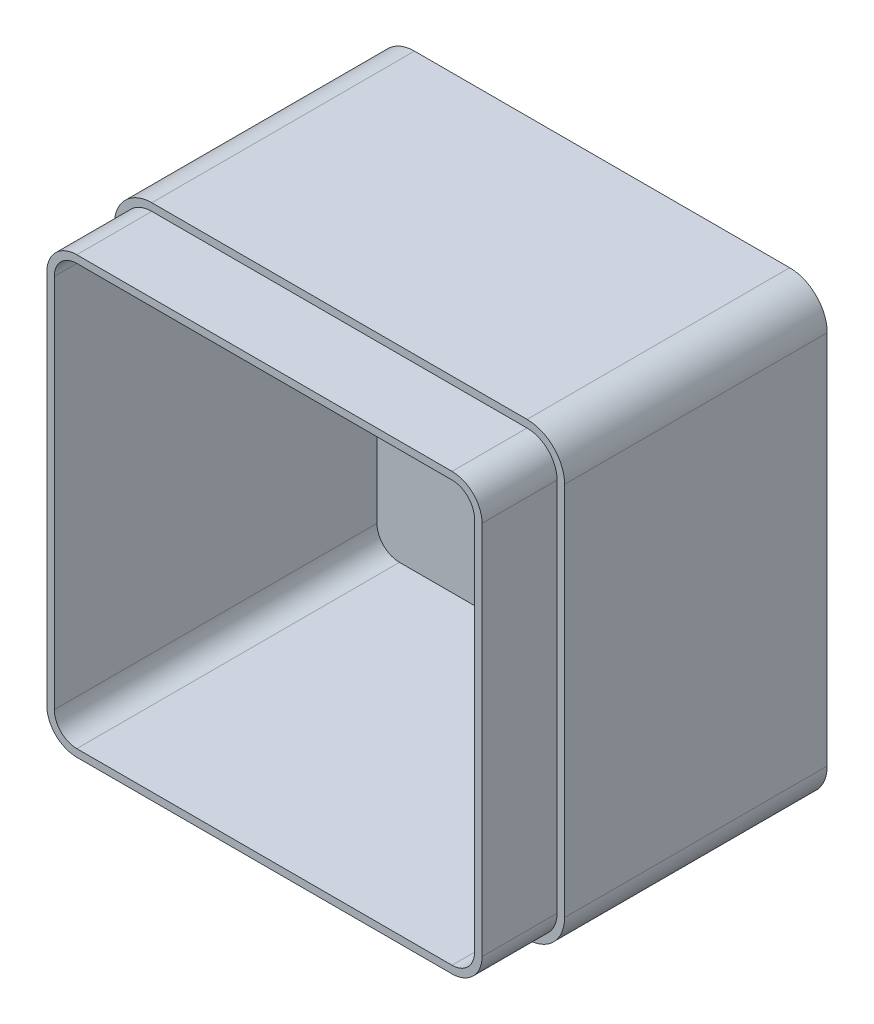
ISO-10303-21;
HEADER;
FILE_DESCRIPTION(('STEP AP214'),'2;1');
FILE_NAME('part.step','',(''),(''),'','','');
FILE_SCHEMA(('AUTOMOTIVE_DESIGN { 1 0 10303 214 1 1 1 1 }'));
ENDSEC;
DATA;
#1=APPLICATION_CONTEXT('core data for automotive mechanical design processes');
#2=APPLICATION_PROTOCOL_DEFINITION('international standard','automotive_design',2000,#1);
#3=PRODUCT_CONTEXT('',#1,'mechanical');
#4=PRODUCT('Part','Part','',(#3));
#5=PRODUCT_RELATED_PRODUCT_CATEGORY('part','',(#4));
#6=PRODUCT_DEFINITION_FORMATION('','',#4);
#7=PRODUCT_DEFINITION_CONTEXT('part definition',#1,'design');
#8=PRODUCT_DEFINITION('design','',#6,#7);
#9=PRODUCT_DEFINITION_SHAPE('','',#8);
#10=(LENGTH_UNIT() NAMED_UNIT(*) SI_UNIT(.MILLI.,.METRE.));
#11=(NAMED_UNIT(*) PLANE_ANGLE_UNIT() SI_UNIT($,.RADIAN.));
#12=(NAMED_UNIT(*) SI_UNIT($,.STERADIAN.) SOLID_ANGLE_UNIT());
#13=UNCERTAINTY_MEASURE_WITH_UNIT(LENGTH_MEASURE(1.E-05),#10,'distance_accuracy_value','');
#14=(GEOMETRIC_REPRESENTATION_CONTEXT(3) GLOBAL_UNCERTAINTY_ASSIGNED_CONTEXT((#13)) GLOBAL_UNIT_ASSIGNED_CONTEXT((#10,
#11,#12)) REPRESENTATION_CONTEXT('',''));
#15=CARTESIAN_POINT('',(0.,0.,0.));
#16=DIRECTION('',(0.,0.,1.));
#17=DIRECTION('',(1.,0.,0.));
#18=AXIS2_PLACEMENT_3D('',#15,#16,#17);
#19=CARTESIAN_POINT('',(0.,0.,90.));
#20=DIRECTION('',(0.,0.,-1.));
#21=DIRECTION('',(-1.,0.,0.));
#22=AXIS2_PLACEMENT_3D('',#19,#20,#21);
#23=PLANE('',#22);
#24=DIRECTION('',(0.,1.,0.));
#25=VECTOR('',#24,1.);
#26=CARTESIAN_POINT('',(116.,0.,90.));
#27=LINE('',#26,#25);
#28=CARTESIAN_POINT('',(116.,10.,90.));
#29=VERTEX_POINT('',#28);
#30=CARTESIAN_POINT('',(116.,110.,90.));
#31=VERTEX_POINT('',#30);
#32=EDGE_CURVE('E340',#29,#31,#27,.T.);
#33=ORIENTED_EDGE('',*,*,#32,.F.);
#34=CARTESIAN_POINT('',(110.,10.,90.));
#35=DIRECTION('',(0.,0.,-1.));
#36=DIRECTION('',(-1.,0.,0.));
#37=AXIS2_PLACEMENT_3D('',#34,#35,#36);
#38=CIRCLE('',#37,6.);
#39=CARTESIAN_POINT('',(110.,4.,90.));
#40=VERTEX_POINT('',#39);
#41=EDGE_CURVE('E338',#40,#29,#38,.F.);
#42=ORIENTED_EDGE('',*,*,#41,.F.);
#43=DIRECTION('',(1.,0.,0.));
#44=VECTOR('',#43,1.);
#45=CARTESIAN_POINT('',(0.,4.,90.));
#46=LINE('',#45,#44);
#47=CARTESIAN_POINT('',(9.99999999999999,4.,90.));
#48=VERTEX_POINT('',#47);
#49=EDGE_CURVE('E335',#48,#40,#46,.T.);
#50=ORIENTED_EDGE('',*,*,#49,.F.);
#51=CARTESIAN_POINT('',(9.99999999999999,10.,90.));
#52=DIRECTION('',(0.,0.,-1.));
#53=DIRECTION('',(-1.,0.,0.));
#54=AXIS2_PLACEMENT_3D('',#51,#52,#53);
#55=CIRCLE('',#54,6.);
#56=CARTESIAN_POINT('',(4.,10.,90.));
#57=VERTEX_POINT('',#56);
#58=EDGE_CURVE('E336',#57,#48,#55,.F.);
#59=ORIENTED_EDGE('',*,*,#58,.F.);
#60=DIRECTION('',(0.,-1.,0.));
#61=VECTOR('',#60,1.);
#62=CARTESIAN_POINT('',(4.,0.,90.));
#63=LINE('',#62,#61);
#64=CARTESIAN_POINT('',(3.99999999999997,110.,90.));
#65=VERTEX_POINT('',#64);
#66=EDGE_CURVE('E301',#65,#57,#63,.T.);
#67=ORIENTED_EDGE('',*,*,#66,.F.);
#68=CARTESIAN_POINT('',(9.99999999999997,110.,90.));
#69=DIRECTION('',(0.,0.,-1.));
#70=DIRECTION('',(-1.,0.,0.));
#71=AXIS2_PLACEMENT_3D('',#68,#69,#70);
#72=CIRCLE('',#71,6.);
#73=CARTESIAN_POINT('',(9.99999999999997,116.,90.));
#74=VERTEX_POINT('',#73);
#75=EDGE_CURVE('E327',#74,#65,#72,.F.);
#76=ORIENTED_EDGE('',*,*,#75,.F.);
#77=DIRECTION('',(-1.,0.,0.));
#78=VECTOR('',#77,1.);
#79=CARTESIAN_POINT('',(0.,116.,90.));
#80=LINE('',#79,#78);
#81=CARTESIAN_POINT('',(110.,116.,90.));
#82=VERTEX_POINT('',#81);
#83=EDGE_CURVE('E332',#82,#74,#80,.T.);
#84=ORIENTED_EDGE('',*,*,#83,.F.);
#85=CARTESIAN_POINT('',(110.,110.,90.));
#86=DIRECTION('',(0.,0.,-1.));
#87=DIRECTION('',(-1.,0.,0.));
#88=AXIS2_PLACEMENT_3D('',#85,#86,#87);
#89=CIRCLE('',#88,6.);
#90=EDGE_CURVE('E322',#31,#82,#89,.F.);
#91=ORIENTED_EDGE('',*,*,#90,.F.);
#92=EDGE_LOOP('',(#33,#42,#50,#59,#67,#76,#84,#91));
#93=FACE_BOUND('',#92,.T.);
#94=CARTESIAN_POINT('',(110.,10.,90.));
#95=DIRECTION('',(0.,0.,1.));
#96=DIRECTION('',(1.,0.,0.));
#97=AXIS2_PLACEMENT_3D('',#94,#95,#96);
#98=CIRCLE('',#97,7.99999999999999);
#99=CARTESIAN_POINT('',(110.,2.,90.));
#100=VERTEX_POINT('',#99);
#101=CARTESIAN_POINT('',(118.,10.,90.));
#102=VERTEX_POINT('',#101);
#103=EDGE_CURVE('E245',#100,#102,#98,.T.);
#104=ORIENTED_EDGE('',*,*,#103,.T.);
#105=DIRECTION('',(0.,1.,0.));
#106=VECTOR('',#105,1.);
#107=CARTESIAN_POINT('',(118.,10.,90.));
#108=LINE('',#107,#106);
#109=CARTESIAN_POINT('',(118.,110.,90.));
#110=VERTEX_POINT('',#109);
#111=EDGE_CURVE('E205',#102,#110,#108,.T.);
#112=ORIENTED_EDGE('',*,*,#111,.T.);
#113=CARTESIAN_POINT('',(110.,110.,90.));
#114=DIRECTION('',(0.,0.,1.));
#115=DIRECTION('',(1.,0.,0.));
#116=AXIS2_PLACEMENT_3D('',#113,#114,#115);
#117=CIRCLE('',#116,7.99999999999999);
#118=CARTESIAN_POINT('',(110.,118.,90.));
#119=VERTEX_POINT('',#118);
#120=EDGE_CURVE('E53',#110,#119,#117,.T.);
#121=ORIENTED_EDGE('',*,*,#120,.T.);
#122=DIRECTION('',(-1.,0.,0.));
#123=VECTOR('',#122,1.);
#124=CARTESIAN_POINT('',(110.,118.,90.));
#125=LINE('',#124,#123);
#126=CARTESIAN_POINT('',(9.99999999999997,118.,90.));
#127=VERTEX_POINT('',#126);
#128=EDGE_CURVE('E249',#119,#127,#125,.T.);
#129=ORIENTED_EDGE('',*,*,#128,.T.);
#130=CARTESIAN_POINT('',(9.99999999999997,110.,90.));
#131=DIRECTION('',(0.,0.,1.));
#132=DIRECTION('',(1.,0.,0.));
#133=AXIS2_PLACEMENT_3D('',#130,#131,#132);
#134=CIRCLE('',#133,7.99999999999999);
#135=CARTESIAN_POINT('',(1.99999999999998,110.,90.));
#136=VERTEX_POINT('',#135);
#137=EDGE_CURVE('E252',#127,#136,#134,.T.);
#138=ORIENTED_EDGE('',*,*,#137,.T.);
#139=DIRECTION('',(0.,-1.,0.));
#140=VECTOR('',#139,1.);
#141=CARTESIAN_POINT('',(1.99999999999998,110.,90.));
#142=LINE('',#141,#140);
#143=CARTESIAN_POINT('',(2.,9.99999999999999,90.));
#144=VERTEX_POINT('',#143);
#145=EDGE_CURVE('E255',#136,#144,#142,.T.);
#146=ORIENTED_EDGE('',*,*,#145,.T.);
#147=CARTESIAN_POINT('',(9.99999999999999,10.,90.));
#148=DIRECTION('',(0.,0.,1.));
#149=DIRECTION('',(1.,0.,0.));
#150=AXIS2_PLACEMENT_3D('',#147,#148,#149);
#151=CIRCLE('',#150,8.);
#152=CARTESIAN_POINT('',(9.99999999999999,2.,90.));
#153=VERTEX_POINT('',#152);
#154=EDGE_CURVE('E228',#144,#153,#151,.T.);
#155=ORIENTED_EDGE('',*,*,#154,.T.);
#156=DIRECTION('',(1.,0.,0.));
#157=VECTOR('',#156,1.);
#158=CARTESIAN_POINT('',(10.,2.,90.));
#159=LINE('',#158,#157);
#160=EDGE_CURVE('E225',#153,#100,#159,.T.);
#161=ORIENTED_EDGE('',*,*,#160,.T.);
#162=EDGE_LOOP('',(#104,#112,#121,#129,#138,#146,#155,#161));
#163=FACE_BOUND('',#162,.T.);
#164=ADVANCED_FACE('F38',(#93,#163),#23,.F.);
#165=CARTESIAN_POINT('',(4.,0.,90.));
#166=DIRECTION('',(1.,0.,0.));
#167=DIRECTION('',(0.,1.,0.));
#168=AXIS2_PLACEMENT_3D('',#165,#166,#167);
#169=PLANE('',#168);
#170=DIRECTION('',(0.,-1.,0.));
#171=VECTOR('',#170,1.);
#172=CARTESIAN_POINT('',(4.,0.,4.));
#173=LINE('',#172,#171);
#174=CARTESIAN_POINT('',(3.99999999999997,110.,4.));
#175=VERTEX_POINT('',#174);
#176=CARTESIAN_POINT('',(4.,10.,4.));
#177=VERTEX_POINT('',#176);
#178=EDGE_CURVE('E287',#175,#177,#173,.T.);
#179=ORIENTED_EDGE('',*,*,#178,.F.);
#180=DIRECTION('',(0.,0.,1.));
#181=VECTOR('',#180,1.);
#182=CARTESIAN_POINT('',(3.99999999999997,110.,90.));
#183=LINE('',#182,#181);
#184=EDGE_CURVE('E294',#65,#175,#183,.F.);
#185=ORIENTED_EDGE('',*,*,#184,.F.);
#186=ORIENTED_EDGE('',*,*,#66,.T.);
#187=DIRECTION('',(0.,0.,1.));
#188=VECTOR('',#187,1.);
#189=CARTESIAN_POINT('',(4.,10.,90.));
#190=LINE('',#189,#188);
#191=EDGE_CURVE('E291',#177,#57,#190,.T.);
#192=ORIENTED_EDGE('',*,*,#191,.F.);
#193=EDGE_LOOP('',(#179,#185,#186,#192));
#194=FACE_BOUND('',#193,.T.);
#195=ADVANCED_FACE('F431',(#194),#169,.T.);
#196=CARTESIAN_POINT('',(0.,4.,90.));
#197=DIRECTION('',(0.,1.,0.));
#198=DIRECTION('',(0.,0.,1.));
#199=AXIS2_PLACEMENT_3D('',#196,#197,#198);
#200=PLANE('',#199);
#201=DIRECTION('',(1.,0.,0.));
#202=VECTOR('',#201,1.);
#203=CARTESIAN_POINT('',(0.,4.,4.));
#204=LINE('',#203,#202);
#205=CARTESIAN_POINT('',(9.99999999999999,4.,4.));
#206=VERTEX_POINT('',#205);
#207=CARTESIAN_POINT('',(110.,4.,4.));
#208=VERTEX_POINT('',#207);
#209=EDGE_CURVE('E290',#206,#208,#204,.T.);
#210=ORIENTED_EDGE('',*,*,#209,.F.);
#211=DIRECTION('',(0.,0.,1.));
#212=VECTOR('',#211,1.);
#213=CARTESIAN_POINT('',(9.99999999999999,4.,90.));
#214=LINE('',#213,#212);
#215=EDGE_CURVE('E319',#48,#206,#214,.F.);
#216=ORIENTED_EDGE('',*,*,#215,.F.);
#217=ORIENTED_EDGE('',*,*,#49,.T.);
#218=DIRECTION('',(0.,0.,1.));
#219=VECTOR('',#218,1.);
#220=CARTESIAN_POINT('',(110.,4.,90.));
#221=LINE('',#220,#219);
#222=EDGE_CURVE('E297',#208,#40,#221,.T.);
#223=ORIENTED_EDGE('',*,*,#222,.F.);
#224=EDGE_LOOP('',(#210,#216,#217,#223));
#225=FACE_BOUND('',#224,.T.);
#226=ADVANCED_FACE('F437',(#225),#200,.T.);
#227=CARTESIAN_POINT('',(116.,0.,90.));
#228=DIRECTION('',(-1.,0.,0.));
#229=DIRECTION('',(0.,-1.,0.));
#230=AXIS2_PLACEMENT_3D('',#227,#228,#229);
#231=PLANE('',#230);
#232=DIRECTION('',(0.,1.,0.));
#233=VECTOR('',#232,1.);
#234=CARTESIAN_POINT('',(116.,0.,4.));
#235=LINE('',#234,#233);
#236=CARTESIAN_POINT('',(116.,10.,4.));
#237=VERTEX_POINT('',#236);
#238=CARTESIAN_POINT('',(116.,110.,4.));
#239=VERTEX_POINT('',#238);
#240=EDGE_CURVE('E302',#237,#239,#235,.T.);
#241=ORIENTED_EDGE('',*,*,#240,.F.);
#242=DIRECTION('',(0.,0.,1.));
#243=VECTOR('',#242,1.);
#244=CARTESIAN_POINT('',(116.,10.,90.));
#245=LINE('',#244,#243);
#246=EDGE_CURVE('E305',#29,#237,#245,.F.);
#247=ORIENTED_EDGE('',*,*,#246,.F.);
#248=ORIENTED_EDGE('',*,*,#32,.T.);
#249=DIRECTION('',(0.,0.,1.));
#250=VECTOR('',#249,1.);
#251=CARTESIAN_POINT('',(116.,110.,90.));
#252=LINE('',#251,#250);
#253=EDGE_CURVE('E325',#239,#31,#252,.T.);
#254=ORIENTED_EDGE('',*,*,#253,.F.);
#255=EDGE_LOOP('',(#241,#247,#248,#254));
#256=FACE_BOUND('',#255,.T.);
#257=ADVANCED_FACE('F466',(#256),#231,.T.);
#258=CARTESIAN_POINT('',(0.,116.,90.));
#259=DIRECTION('',(0.,-1.,0.));
#260=DIRECTION('',(0.,0.,-1.));
#261=AXIS2_PLACEMENT_3D('',#258,#259,#260);
#262=PLANE('',#261);
#263=ORIENTED_EDGE('',*,*,#83,.T.);
#264=DIRECTION('',(0.,0.,-1.));
#265=VECTOR('',#264,1.);
#266=CARTESIAN_POINT('',(9.99999999999997,116.,90.));
#267=LINE('',#266,#265);
#268=CARTESIAN_POINT('',(9.99999999999997,116.,4.));
#269=VERTEX_POINT('',#268);
#270=EDGE_CURVE('E330',#269,#74,#267,.F.);
#271=ORIENTED_EDGE('',*,*,#270,.F.);
#272=DIRECTION('',(-1.,0.,0.));
#273=VECTOR('',#272,1.);
#274=CARTESIAN_POINT('',(0.,116.,4.));
#275=LINE('',#274,#273);
#276=CARTESIAN_POINT('',(110.,116.,4.));
#277=VERTEX_POINT('',#276);
#278=EDGE_CURVE('E298',#277,#269,#275,.T.);
#279=ORIENTED_EDGE('',*,*,#278,.F.);
#280=DIRECTION('',(0.,0.,-1.));
#281=VECTOR('',#280,1.);
#282=CARTESIAN_POINT('',(110.,116.,90.));
#283=LINE('',#282,#281);
#284=EDGE_CURVE('E316',#82,#277,#283,.T.);
#285=ORIENTED_EDGE('',*,*,#284,.F.);
#286=EDGE_LOOP('',(#263,#271,#279,#285));
#287=FACE_BOUND('',#286,.T.);
#288=ADVANCED_FACE('F470',(#287),#262,.T.);
#289=CARTESIAN_POINT('',(0.,0.,4.));
#290=DIRECTION('',(0.,0.,-1.));
#291=DIRECTION('',(-1.,0.,0.));
#292=AXIS2_PLACEMENT_3D('',#289,#290,#291);
#293=PLANE('',#292);
#294=ORIENTED_EDGE('',*,*,#278,.T.);
#295=CARTESIAN_POINT('',(9.99999999999997,110.,4.));
#296=DIRECTION('',(0.,0.,-1.));
#297=DIRECTION('',(-1.,0.,0.));
#298=AXIS2_PLACEMENT_3D('',#295,#296,#297);
#299=CIRCLE('',#298,6.);
#300=EDGE_CURVE('E314',#175,#269,#299,.T.);
#301=ORIENTED_EDGE('',*,*,#300,.F.);
#302=ORIENTED_EDGE('',*,*,#178,.T.);
#303=CARTESIAN_POINT('',(9.99999999999999,10.,4.));
#304=DIRECTION('',(0.,0.,-1.));
#305=DIRECTION('',(-1.,0.,0.));
#306=AXIS2_PLACEMENT_3D('',#303,#304,#305);
#307=CIRCLE('',#306,6.);
#308=EDGE_CURVE('E310',#206,#177,#307,.T.);
#309=ORIENTED_EDGE('',*,*,#308,.F.);
#310=ORIENTED_EDGE('',*,*,#209,.T.);
#311=CARTESIAN_POINT('',(110.,10.,4.));
#312=DIRECTION('',(0.,0.,-1.));
#313=DIRECTION('',(-1.,0.,0.));
#314=AXIS2_PLACEMENT_3D('',#311,#312,#313);
#315=CIRCLE('',#314,6.);
#316=EDGE_CURVE('E306',#237,#208,#315,.T.);
#317=ORIENTED_EDGE('',*,*,#316,.F.);
#318=ORIENTED_EDGE('',*,*,#240,.T.);
#319=CARTESIAN_POINT('',(110.,110.,4.));
#320=DIRECTION('',(0.,0.,-1.));
#321=DIRECTION('',(-1.,0.,0.));
#322=AXIS2_PLACEMENT_3D('',#319,#320,#321);
#323=CIRCLE('',#322,6.);
#324=EDGE_CURVE('E303',#277,#239,#323,.T.);
#325=ORIENTED_EDGE('',*,*,#324,.F.);
#326=EDGE_LOOP('',(#294,#301,#302,#309,#310,#317,#318,#325));
#327=FACE_BOUND('',#326,.T.);
#328=ADVANCED_FACE('F474',(#327),#293,.F.);
#329=CARTESIAN_POINT('',(110.,110.,90.));
#330=DIRECTION('',(0.,0.,-1.));
#331=DIRECTION('',(-1.,0.,0.));
#332=AXIS2_PLACEMENT_3D('',#329,#330,#331);
#333=CYLINDRICAL_SURFACE('',#332,6.);
#334=ORIENTED_EDGE('',*,*,#90,.T.);
#335=ORIENTED_EDGE('',*,*,#284,.T.);
#336=ORIENTED_EDGE('',*,*,#324,.T.);
#337=ORIENTED_EDGE('',*,*,#253,.T.);
#338=EDGE_LOOP('',(#334,#335,#336,#337));
#339=FACE_BOUND('',#338,.T.);
#340=ADVANCED_FACE('F478',(#339),#333,.F.);
#341=CARTESIAN_POINT('',(110.,10.,90.));
#342=DIRECTION('',(0.,0.,-1.));
#343=DIRECTION('',(-1.,0.,0.));
#344=AXIS2_PLACEMENT_3D('',#341,#342,#343);
#345=CYLINDRICAL_SURFACE('',#344,6.);
#346=ORIENTED_EDGE('',*,*,#41,.T.);
#347=ORIENTED_EDGE('',*,*,#246,.T.);
#348=ORIENTED_EDGE('',*,*,#316,.T.);
#349=ORIENTED_EDGE('',*,*,#222,.T.);
#350=EDGE_LOOP('',(#346,#347,#348,#349));
#351=FACE_BOUND('',#350,.T.);
#352=ADVANCED_FACE('F482',(#351),#345,.F.);
#353=CARTESIAN_POINT('',(9.99999999999999,10.,90.));
#354=DIRECTION('',(0.,0.,-1.));
#355=DIRECTION('',(-1.,0.,0.));
#356=AXIS2_PLACEMENT_3D('',#353,#354,#355);
#357=CYLINDRICAL_SURFACE('',#356,6.);
#358=ORIENTED_EDGE('',*,*,#58,.T.);
#359=ORIENTED_EDGE('',*,*,#215,.T.);
#360=ORIENTED_EDGE('',*,*,#308,.T.);
#361=ORIENTED_EDGE('',*,*,#191,.T.);
#362=EDGE_LOOP('',(#358,#359,#360,#361));
#363=FACE_BOUND('',#362,.T.);
#364=ADVANCED_FACE('F485',(#363),#357,.F.);
#365=CARTESIAN_POINT('',(9.99999999999997,110.,90.));
#366=DIRECTION('',(0.,0.,-1.));
#367=DIRECTION('',(-1.,0.,0.));
#368=AXIS2_PLACEMENT_3D('',#365,#366,#367);
#369=CYLINDRICAL_SURFACE('',#368,6.);
#370=ORIENTED_EDGE('',*,*,#75,.T.);
#371=ORIENTED_EDGE('',*,*,#184,.T.);
#372=ORIENTED_EDGE('',*,*,#300,.T.);
#373=ORIENTED_EDGE('',*,*,#270,.T.);
#374=EDGE_LOOP('',(#370,#371,#372,#373));
#375=FACE_BOUND('',#374,.T.);
#376=ADVANCED_FACE('F443',(#375),#369,.F.);
#377=CARTESIAN_POINT('',(110.,10.,70.));
#378=DIRECTION('',(0.,0.,1.));
#379=DIRECTION('',(1.,0.,0.));
#380=AXIS2_PLACEMENT_3D('',#377,#378,#379);
#381=PLANE('',#380);
#382=DIRECTION('',(1.,0.,0.));
#383=VECTOR('',#382,1.);
#384=CARTESIAN_POINT('',(10.,2.,70.));
#385=LINE('',#384,#383);
#386=CARTESIAN_POINT('',(9.99999999999999,2.,70.));
#387=VERTEX_POINT('',#386);
#388=CARTESIAN_POINT('',(110.,2.,70.));
#389=VERTEX_POINT('',#388);
#390=EDGE_CURVE('E211',#387,#389,#385,.T.);
#391=ORIENTED_EDGE('',*,*,#390,.F.);
#392=CARTESIAN_POINT('',(9.99999999999999,10.,70.));
#393=DIRECTION('',(0.,0.,1.));
#394=DIRECTION('',(1.,0.,0.));
#395=AXIS2_PLACEMENT_3D('',#392,#393,#394);
#396=CIRCLE('',#395,8.);
#397=CARTESIAN_POINT('',(2.,9.99999999999999,70.));
#398=VERTEX_POINT('',#397);
#399=EDGE_CURVE('E241',#398,#387,#396,.T.);
#400=ORIENTED_EDGE('',*,*,#399,.F.);
#401=DIRECTION('',(0.,-1.,0.));
#402=VECTOR('',#401,1.);
#403=CARTESIAN_POINT('',(1.99999999999998,110.,70.));
#404=LINE('',#403,#402);
#405=CARTESIAN_POINT('',(1.99999999999998,110.,70.));
#406=VERTEX_POINT('',#405);
#407=EDGE_CURVE('E238',#406,#398,#404,.T.);
#408=ORIENTED_EDGE('',*,*,#407,.F.);
#409=CARTESIAN_POINT('',(9.99999999999997,110.,70.));
#410=DIRECTION('',(0.,0.,1.));
#411=DIRECTION('',(1.,0.,0.));
#412=AXIS2_PLACEMENT_3D('',#409,#410,#411);
#413=CIRCLE('',#412,7.99999999999999);
#414=CARTESIAN_POINT('',(9.99999999999997,118.,70.));
#415=VERTEX_POINT('',#414);
#416=EDGE_CURVE('E235',#415,#406,#413,.T.);
#417=ORIENTED_EDGE('',*,*,#416,.F.);
#418=DIRECTION('',(-1.,0.,0.));
#419=VECTOR('',#418,1.);
#420=CARTESIAN_POINT('',(110.,118.,70.));
#421=LINE('',#420,#419);
#422=CARTESIAN_POINT('',(110.,118.,70.));
#423=VERTEX_POINT('',#422);
#424=EDGE_CURVE('E232',#423,#415,#421,.T.);
#425=ORIENTED_EDGE('',*,*,#424,.F.);
#426=CARTESIAN_POINT('',(110.,110.,70.));
#427=DIRECTION('',(0.,0.,1.));
#428=DIRECTION('',(1.,0.,0.));
#429=AXIS2_PLACEMENT_3D('',#426,#427,#428);
#430=CIRCLE('',#429,7.99999999999999);
#431=CARTESIAN_POINT('',(118.,110.,70.));
#432=VERTEX_POINT('',#431);
#433=EDGE_CURVE('E221',#432,#423,#430,.T.);
#434=ORIENTED_EDGE('',*,*,#433,.F.);
#435=DIRECTION('',(0.,1.,0.));
#436=VECTOR('',#435,1.);
#437=CARTESIAN_POINT('',(118.,10.,70.));
#438=LINE('',#437,#436);
#439=CARTESIAN_POINT('',(118.,10.,70.));
#440=VERTEX_POINT('',#439);
#441=EDGE_CURVE('E203',#440,#432,#438,.T.);
#442=ORIENTED_EDGE('',*,*,#441,.F.);
#443=CARTESIAN_POINT('',(110.,10.,70.));
#444=DIRECTION('',(0.,0.,1.));
#445=DIRECTION('',(1.,0.,0.));
#446=AXIS2_PLACEMENT_3D('',#443,#444,#445);
#447=CIRCLE('',#446,7.99999999999999);
#448=EDGE_CURVE('E217',#389,#440,#447,.T.);
#449=ORIENTED_EDGE('',*,*,#448,.F.);
#450=EDGE_LOOP('',(#391,#400,#408,#417,#425,#434,#442,#449));
#451=FACE_BOUND('',#450,.T.);
#452=CARTESIAN_POINT('',(110.,10.,70.));
#453=DIRECTION('',(0.,0.,1.));
#454=DIRECTION('',(1.,0.,0.));
#455=AXIS2_PLACEMENT_3D('',#452,#453,#454);
#456=CIRCLE('',#455,9.99999999999999);
#457=CARTESIAN_POINT('',(110.,0.,70.));
#458=VERTEX_POINT('',#457);
#459=CARTESIAN_POINT('',(120.,10.,70.));
#460=VERTEX_POINT('',#459);
#461=EDGE_CURVE('E261',#458,#460,#456,.T.);
#462=ORIENTED_EDGE('',*,*,#461,.T.);
#463=DIRECTION('',(0.,1.,0.));
#464=VECTOR('',#463,1.);
#465=CARTESIAN_POINT('',(120.,10.,70.));
#466=LINE('',#465,#464);
#467=CARTESIAN_POINT('',(120.,110.,70.));
#468=VERTEX_POINT('',#467);
#469=EDGE_CURVE('E274',#460,#468,#466,.T.);
#470=ORIENTED_EDGE('',*,*,#469,.T.);
#471=CARTESIAN_POINT('',(110.,110.,70.));
#472=DIRECTION('',(0.,0.,1.));
#473=DIRECTION('',(1.,0.,0.));
#474=AXIS2_PLACEMENT_3D('',#471,#472,#473);
#475=CIRCLE('',#474,9.99999999999999);
#476=CARTESIAN_POINT('',(110.,120.,70.));
#477=VERTEX_POINT('',#476);
#478=EDGE_CURVE('E276',#468,#477,#475,.T.);
#479=ORIENTED_EDGE('',*,*,#478,.T.);
#480=DIRECTION('',(-1.,0.,0.));
#481=VECTOR('',#480,1.);
#482=CARTESIAN_POINT('',(110.,120.,70.));
#483=LINE('',#482,#481);
#484=CARTESIAN_POINT('',(9.99999999999997,120.,70.));
#485=VERTEX_POINT('',#484);
#486=EDGE_CURVE('E61',#477,#485,#483,.T.);
#487=ORIENTED_EDGE('',*,*,#486,.T.);
#488=CARTESIAN_POINT('',(9.99999999999997,110.,70.));
#489=DIRECTION('',(0.,0.,1.));
#490=DIRECTION('',(1.,0.,0.));
#491=AXIS2_PLACEMENT_3D('',#488,#489,#490);
#492=CIRCLE('',#491,9.99999999999999);
#493=CARTESIAN_POINT('',(0.,110.,70.));
#494=VERTEX_POINT('',#493);
#495=EDGE_CURVE('E279',#485,#494,#492,.T.);
#496=ORIENTED_EDGE('',*,*,#495,.T.);
#497=DIRECTION('',(0.,-1.,0.));
#498=VECTOR('',#497,1.);
#499=CARTESIAN_POINT('',(0.,110.,70.));
#500=LINE('',#499,#498);
#501=CARTESIAN_POINT('',(0.,10.,70.));
#502=VERTEX_POINT('',#501);
#503=EDGE_CURVE('E281',#494,#502,#500,.T.);
#504=ORIENTED_EDGE('',*,*,#503,.T.);
#505=CARTESIAN_POINT('',(9.99999999999999,10.,70.));
#506=DIRECTION('',(0.,0.,1.));
#507=DIRECTION('',(1.,0.,0.));
#508=AXIS2_PLACEMENT_3D('',#505,#506,#507);
#509=CIRCLE('',#508,10.);
#510=CARTESIAN_POINT('',(9.99999999999999,0.,70.));
#511=VERTEX_POINT('',#510);
#512=EDGE_CURVE('E283',#502,#511,#509,.T.);
#513=ORIENTED_EDGE('',*,*,#512,.T.);
#514=DIRECTION('',(1.,0.,0.));
#515=VECTOR('',#514,1.);
#516=CARTESIAN_POINT('',(9.99999999999999,0.,70.));
#517=LINE('',#516,#515);
#518=EDGE_CURVE('E285',#511,#458,#517,.T.);
#519=ORIENTED_EDGE('',*,*,#518,.T.);
#520=EDGE_LOOP('',(#462,#470,#479,#487,#496,#504,#513,#519));
#521=FACE_BOUND('',#520,.T.);
#522=ADVANCED_FACE('F216',(#451,#521),#381,.T.);
#523=CARTESIAN_POINT('',(110.,10.,70.));
#524=DIRECTION('',(0.,0.,1.));
#525=DIRECTION('',(1.,0.,0.));
#526=AXIS2_PLACEMENT_3D('',#523,#524,#525);
#527=CYLINDRICAL_SURFACE('',#526,7.99999999999999);
#528=ORIENTED_EDGE('',*,*,#103,.F.);
#529=DIRECTION('',(0.,0.,1.));
#530=VECTOR('',#529,1.);
#531=CARTESIAN_POINT('',(110.,2.,70.));
#532=LINE('',#531,#530);
#533=EDGE_CURVE('E224',#389,#100,#532,.T.);
#534=ORIENTED_EDGE('',*,*,#533,.F.);
#535=ORIENTED_EDGE('',*,*,#448,.T.);
#536=DIRECTION('',(0.,0.,1.));
#537=VECTOR('',#536,1.);
#538=CARTESIAN_POINT('',(118.,10.,70.));
#539=LINE('',#538,#537);
#540=EDGE_CURVE('E200',#440,#102,#539,.T.);
#541=ORIENTED_EDGE('',*,*,#540,.T.);
#542=EDGE_LOOP('',(#528,#534,#535,#541));
#543=FACE_BOUND('',#542,.T.);
#544=ADVANCED_FACE('F223',(#543),#527,.T.);
#545=CARTESIAN_POINT('',(10.,2.,70.));
#546=DIRECTION('',(0.,-1.,0.));
#547=DIRECTION('',(0.,0.,-1.));
#548=AXIS2_PLACEMENT_3D('',#545,#546,#547);
#549=PLANE('',#548);
#550=ORIENTED_EDGE('',*,*,#160,.F.);
#551=DIRECTION('',(0.,0.,1.));
#552=VECTOR('',#551,1.);
#553=CARTESIAN_POINT('',(9.99999999999999,2.,70.));
#554=LINE('',#553,#552);
#555=EDGE_CURVE('E262',#387,#153,#554,.T.);
#556=ORIENTED_EDGE('',*,*,#555,.F.);
#557=ORIENTED_EDGE('',*,*,#390,.T.);
#558=ORIENTED_EDGE('',*,*,#533,.T.);
#559=EDGE_LOOP('',(#550,#556,#557,#558));
#560=FACE_BOUND('',#559,.T.);
#561=ADVANCED_FACE('F461',(#560),#549,.T.);
#562=CARTESIAN_POINT('',(9.99999999999999,10.,70.));
#563=DIRECTION('',(0.,0.,1.));
#564=DIRECTION('',(1.,0.,0.));
#565=AXIS2_PLACEMENT_3D('',#562,#563,#564);
#566=CYLINDRICAL_SURFACE('',#565,8.);
#567=ORIENTED_EDGE('',*,*,#154,.F.);
#568=DIRECTION('',(0.,0.,1.));
#569=VECTOR('',#568,1.);
#570=CARTESIAN_POINT('',(2.,9.99999999999999,70.));
#571=LINE('',#570,#569);
#572=EDGE_CURVE('E264',#398,#144,#571,.T.);
#573=ORIENTED_EDGE('',*,*,#572,.F.);
#574=ORIENTED_EDGE('',*,*,#399,.T.);
#575=ORIENTED_EDGE('',*,*,#555,.T.);
#576=EDGE_LOOP('',(#567,#573,#574,#575));
#577=FACE_BOUND('',#576,.T.);
#578=ADVANCED_FACE('F528',(#577),#566,.T.);
#579=CARTESIAN_POINT('',(1.99999999999998,110.,70.));
#580=DIRECTION('',(-1.,0.,0.));
#581=DIRECTION('',(0.,-1.,0.));
#582=AXIS2_PLACEMENT_3D('',#579,#580,#581);
#583=PLANE('',#582);
#584=ORIENTED_EDGE('',*,*,#145,.F.);
#585=DIRECTION('',(0.,0.,1.));
#586=VECTOR('',#585,1.);
#587=CARTESIAN_POINT('',(1.99999999999998,110.,70.));
#588=LINE('',#587,#586);
#589=EDGE_CURVE('E266',#406,#136,#588,.T.);
#590=ORIENTED_EDGE('',*,*,#589,.F.);
#591=ORIENTED_EDGE('',*,*,#407,.T.);
#592=ORIENTED_EDGE('',*,*,#572,.T.);
#593=EDGE_LOOP('',(#584,#590,#591,#592));
#594=FACE_BOUND('',#593,.T.);
#595=ADVANCED_FACE('F536',(#594),#583,.T.);
#596=CARTESIAN_POINT('',(9.99999999999997,110.,70.));
#597=DIRECTION('',(0.,0.,1.));
#598=DIRECTION('',(1.,0.,0.));
#599=AXIS2_PLACEMENT_3D('',#596,#597,#598);
#600=CYLINDRICAL_SURFACE('',#599,7.99999999999999);
#601=ORIENTED_EDGE('',*,*,#137,.F.);
#602=DIRECTION('',(0.,0.,1.));
#603=VECTOR('',#602,1.);
#604=CARTESIAN_POINT('',(9.99999999999997,118.,70.));
#605=LINE('',#604,#603);
#606=EDGE_CURVE('E268',#415,#127,#605,.T.);
#607=ORIENTED_EDGE('',*,*,#606,.F.);
#608=ORIENTED_EDGE('',*,*,#416,.T.);
#609=ORIENTED_EDGE('',*,*,#589,.T.);
#610=EDGE_LOOP('',(#601,#607,#608,#609));
#611=FACE_BOUND('',#610,.T.);
#612=ADVANCED_FACE('F544',(#611),#600,.T.);
#613=CARTESIAN_POINT('',(110.,118.,70.));
#614=DIRECTION('',(0.,1.,0.));
#615=DIRECTION('',(0.,0.,1.));
#616=AXIS2_PLACEMENT_3D('',#613,#614,#615);
#617=PLANE('',#616);
#618=ORIENTED_EDGE('',*,*,#128,.F.);
#619=DIRECTION('',(0.,0.,1.));
#620=VECTOR('',#619,1.);
#621=CARTESIAN_POINT('',(110.,118.,70.));
#622=LINE('',#621,#620);
#623=EDGE_CURVE('E270',#423,#119,#622,.T.);
#624=ORIENTED_EDGE('',*,*,#623,.F.);
#625=ORIENTED_EDGE('',*,*,#424,.T.);
#626=ORIENTED_EDGE('',*,*,#606,.T.);
#627=EDGE_LOOP('',(#618,#624,#625,#626));
#628=FACE_BOUND('',#627,.T.);
#629=ADVANCED_FACE('F455',(#628),#617,.T.);
#630=CARTESIAN_POINT('',(110.,110.,70.));
#631=DIRECTION('',(0.,0.,1.));
#632=DIRECTION('',(1.,0.,0.));
#633=AXIS2_PLACEMENT_3D('',#630,#631,#632);
#634=CYLINDRICAL_SURFACE('',#633,7.99999999999999);
#635=ORIENTED_EDGE('',*,*,#120,.F.);
#636=DIRECTION('',(0.,0.,1.));
#637=VECTOR('',#636,1.);
#638=CARTESIAN_POINT('',(118.,110.,70.));
#639=LINE('',#638,#637);
#640=EDGE_CURVE('E210',#432,#110,#639,.T.);
#641=ORIENTED_EDGE('',*,*,#640,.F.);
#642=ORIENTED_EDGE('',*,*,#433,.T.);
#643=ORIENTED_EDGE('',*,*,#623,.T.);
#644=EDGE_LOOP('',(#635,#641,#642,#643));
#645=FACE_BOUND('',#644,.T.);
#646=ADVANCED_FACE('F450',(#645),#634,.T.);
#647=CARTESIAN_POINT('',(118.,10.,70.));
#648=DIRECTION('',(1.,0.,0.));
#649=DIRECTION('',(0.,1.,0.));
#650=AXIS2_PLACEMENT_3D('',#647,#648,#649);
#651=PLANE('',#650);
#652=ORIENTED_EDGE('',*,*,#111,.F.);
#653=ORIENTED_EDGE('',*,*,#540,.F.);
#654=ORIENTED_EDGE('',*,*,#441,.T.);
#655=ORIENTED_EDGE('',*,*,#640,.T.);
#656=EDGE_LOOP('',(#652,#653,#654,#655));
#657=FACE_BOUND('',#656,.T.);
#658=ADVANCED_FACE('F202',(#657),#651,.T.);
#659=CARTESIAN_POINT('',(0.,0.,0.));
#660=DIRECTION('',(0.,0.,-1.));
#661=DIRECTION('',(-1.,0.,0.));
#662=AXIS2_PLACEMENT_3D('',#659,#660,#661);
#663=PLANE('',#662);
#664=DIRECTION('',(-1.,0.,0.));
#665=VECTOR('',#664,1.);
#666=CARTESIAN_POINT('',(0.,120.,0.));
#667=LINE('',#666,#665);
#668=CARTESIAN_POINT('',(110.,120.,0.));
#669=VERTEX_POINT('',#668);
#670=CARTESIAN_POINT('',(9.99999999999997,120.,0.));
#671=VERTEX_POINT('',#670);
#672=EDGE_CURVE('E356',#669,#671,#667,.T.);
#673=ORIENTED_EDGE('',*,*,#672,.F.);
#674=CARTESIAN_POINT('',(110.,110.,0.));
#675=DIRECTION('',(0.,0.,-1.));
#676=DIRECTION('',(-1.,0.,0.));
#677=AXIS2_PLACEMENT_3D('',#674,#675,#676);
#678=CIRCLE('',#677,10.);
#679=CARTESIAN_POINT('',(120.,110.,0.));
#680=VERTEX_POINT('',#679);
#681=EDGE_CURVE('E370',#669,#680,#678,.T.);
#682=ORIENTED_EDGE('',*,*,#681,.T.);
#683=DIRECTION('',(0.,1.,0.));
#684=VECTOR('',#683,1.);
#685=CARTESIAN_POINT('',(120.,0.,0.));
#686=LINE('',#685,#684);
#687=CARTESIAN_POINT('',(120.,10.,0.));
#688=VERTEX_POINT('',#687);
#689=EDGE_CURVE('E353',#688,#680,#686,.T.);
#690=ORIENTED_EDGE('',*,*,#689,.F.);
#691=CARTESIAN_POINT('',(110.,10.,0.));
#692=DIRECTION('',(0.,0.,-1.));
#693=DIRECTION('',(-1.,0.,0.));
#694=AXIS2_PLACEMENT_3D('',#691,#692,#693);
#695=CIRCLE('',#694,10.);
#696=CARTESIAN_POINT('',(110.,0.,0.));
#697=VERTEX_POINT('',#696);
#698=EDGE_CURVE('E368',#688,#697,#695,.T.);
#699=ORIENTED_EDGE('',*,*,#698,.T.);
#700=DIRECTION('',(1.,0.,0.));
#701=VECTOR('',#700,1.);
#702=CARTESIAN_POINT('',(0.,0.,0.));
#703=LINE('',#702,#701);
#704=CARTESIAN_POINT('',(9.99999999999999,0.,0.));
#705=VERTEX_POINT('',#704);
#706=EDGE_CURVE('E350',#705,#697,#703,.T.);
#707=ORIENTED_EDGE('',*,*,#706,.F.);
#708=CARTESIAN_POINT('',(9.99999999999999,10.,0.));
#709=DIRECTION('',(0.,0.,-1.));
#710=DIRECTION('',(-1.,0.,0.));
#711=AXIS2_PLACEMENT_3D('',#708,#709,#710);
#712=CIRCLE('',#711,10.);
#713=CARTESIAN_POINT('',(0.,10.,0.));
#714=VERTEX_POINT('',#713);
#715=EDGE_CURVE('E366',#705,#714,#712,.T.);
#716=ORIENTED_EDGE('',*,*,#715,.T.);
#717=DIRECTION('',(0.,-1.,0.));
#718=VECTOR('',#717,1.);
#719=CARTESIAN_POINT('',(0.,0.,0.));
#720=LINE('',#719,#718);
#721=CARTESIAN_POINT('',(0.,110.,0.));
#722=VERTEX_POINT('',#721);
#723=EDGE_CURVE('E293',#722,#714,#720,.T.);
#724=ORIENTED_EDGE('',*,*,#723,.F.);
#725=CARTESIAN_POINT('',(9.99999999999997,110.,0.));
#726=DIRECTION('',(0.,0.,-1.));
#727=DIRECTION('',(-1.,0.,0.));
#728=AXIS2_PLACEMENT_3D('',#725,#726,#727);
#729=CIRCLE('',#728,10.);
#730=EDGE_CURVE('E364',#722,#671,#729,.T.);
#731=ORIENTED_EDGE('',*,*,#730,.T.);
#732=EDGE_LOOP('',(#673,#682,#690,#699,#707,#716,#724,#731));
#733=FACE_BOUND('',#732,.T.);
#734=ADVANCED_FACE('F392',(#733),#663,.T.);
#735=CARTESIAN_POINT('',(9.99999999999997,110.,90.));
#736=DIRECTION('',(0.,0.,-1.));
#737=DIRECTION('',(-1.,0.,0.));
#738=AXIS2_PLACEMENT_3D('',#735,#736,#737);
#739=CYLINDRICAL_SURFACE('',#738,10.);
#740=DIRECTION('',(0.,0.,-1.));
#741=VECTOR('',#740,1.);
#742=CARTESIAN_POINT('',(0.,110.,90.));
#743=LINE('',#742,#741);
#744=EDGE_CURVE('E46',#494,#722,#743,.T.);
#745=ORIENTED_EDGE('',*,*,#744,.F.);
#746=ORIENTED_EDGE('',*,*,#495,.F.);
#747=DIRECTION('',(0.,0.,-1.));
#748=VECTOR('',#747,1.);
#749=CARTESIAN_POINT('',(9.99999999999997,120.,90.));
#750=LINE('',#749,#748);
#751=EDGE_CURVE('E359',#671,#485,#750,.F.);
#752=ORIENTED_EDGE('',*,*,#751,.F.);
#753=ORIENTED_EDGE('',*,*,#730,.F.);
#754=EDGE_LOOP('',(#745,#746,#752,#753));
#755=FACE_BOUND('',#754,.T.);
#756=ADVANCED_FACE('F40',(#755),#739,.T.);
#757=CARTESIAN_POINT('',(110.,110.,90.));
#758=DIRECTION('',(0.,0.,-1.));
#759=DIRECTION('',(-1.,0.,0.));
#760=AXIS2_PLACEMENT_3D('',#757,#758,#759);
#761=CYLINDRICAL_SURFACE('',#760,10.);
#762=DIRECTION('',(0.,0.,-1.));
#763=VECTOR('',#762,1.);
#764=CARTESIAN_POINT('',(110.,120.,90.));
#765=LINE('',#764,#763);
#766=EDGE_CURVE('E362',#477,#669,#765,.T.);
#767=ORIENTED_EDGE('',*,*,#766,.F.);
#768=ORIENTED_EDGE('',*,*,#478,.F.);
#769=DIRECTION('',(0.,0.,-1.));
#770=VECTOR('',#769,1.);
#771=CARTESIAN_POINT('',(120.,110.,90.));
#772=LINE('',#771,#770);
#773=EDGE_CURVE('E374',#680,#468,#772,.F.);
#774=ORIENTED_EDGE('',*,*,#773,.F.);
#775=ORIENTED_EDGE('',*,*,#681,.F.);
#776=EDGE_LOOP('',(#767,#768,#774,#775));
#777=FACE_BOUND('',#776,.T.);
#778=ADVANCED_FACE('F417',(#777),#761,.T.);
#779=CARTESIAN_POINT('',(0.,120.,90.));
#780=DIRECTION('',(0.,-1.,0.));
#781=DIRECTION('',(0.,0.,-1.));
#782=AXIS2_PLACEMENT_3D('',#779,#780,#781);
#783=PLANE('',#782);
#784=ORIENTED_EDGE('',*,*,#486,.F.);
#785=ORIENTED_EDGE('',*,*,#766,.T.);
#786=ORIENTED_EDGE('',*,*,#672,.T.);
#787=ORIENTED_EDGE('',*,*,#751,.T.);
#788=EDGE_LOOP('',(#784,#785,#786,#787));
#789=FACE_BOUND('',#788,.T.);
#790=ADVANCED_FACE('F419',(#789),#783,.F.);
#791=CARTESIAN_POINT('',(110.,10.,90.));
#792=DIRECTION('',(0.,0.,-1.));
#793=DIRECTION('',(-1.,0.,0.));
#794=AXIS2_PLACEMENT_3D('',#791,#792,#793);
#795=CYLINDRICAL_SURFACE('',#794,10.);
#796=DIRECTION('',(0.,0.,-1.));
#797=VECTOR('',#796,1.);
#798=CARTESIAN_POINT('',(120.,10.,90.));
#799=LINE('',#798,#797);
#800=EDGE_CURVE('E372',#460,#688,#799,.T.);
#801=ORIENTED_EDGE('',*,*,#800,.F.);
#802=ORIENTED_EDGE('',*,*,#461,.F.);
#803=DIRECTION('',(0.,0.,-1.));
#804=VECTOR('',#803,1.);
#805=CARTESIAN_POINT('',(110.,0.,90.));
#806=LINE('',#805,#804);
#807=EDGE_CURVE('E379',#697,#458,#806,.F.);
#808=ORIENTED_EDGE('',*,*,#807,.F.);
#809=ORIENTED_EDGE('',*,*,#698,.F.);
#810=EDGE_LOOP('',(#801,#802,#808,#809));
#811=FACE_BOUND('',#810,.T.);
#812=ADVANCED_FACE('F407',(#811),#795,.T.);
#813=CARTESIAN_POINT('',(120.,0.,90.));
#814=DIRECTION('',(-1.,0.,0.));
#815=DIRECTION('',(0.,-1.,0.));
#816=AXIS2_PLACEMENT_3D('',#813,#814,#815);
#817=PLANE('',#816);
#818=ORIENTED_EDGE('',*,*,#469,.F.);
#819=ORIENTED_EDGE('',*,*,#800,.T.);
#820=ORIENTED_EDGE('',*,*,#689,.T.);
#821=ORIENTED_EDGE('',*,*,#773,.T.);
#822=EDGE_LOOP('',(#818,#819,#820,#821));
#823=FACE_BOUND('',#822,.T.);
#824=ADVANCED_FACE('F412',(#823),#817,.F.);
#825=CARTESIAN_POINT('',(9.99999999999999,10.,90.));
#826=DIRECTION('',(0.,0.,-1.));
#827=DIRECTION('',(-1.,0.,0.));
#828=AXIS2_PLACEMENT_3D('',#825,#826,#827);
#829=CYLINDRICAL_SURFACE('',#828,10.);
#830=DIRECTION('',(0.,0.,-1.));
#831=VECTOR('',#830,1.);
#832=CARTESIAN_POINT('',(9.99999999999999,0.,90.));
#833=LINE('',#832,#831);
#834=EDGE_CURVE('E377',#511,#705,#833,.T.);
#835=ORIENTED_EDGE('',*,*,#834,.F.);
#836=ORIENTED_EDGE('',*,*,#512,.F.);
#837=DIRECTION('',(0.,0.,-1.));
#838=VECTOR('',#837,1.);
#839=CARTESIAN_POINT('',(0.,10.,90.));
#840=LINE('',#839,#838);
#841=EDGE_CURVE('E11',#714,#502,#840,.F.);
#842=ORIENTED_EDGE('',*,*,#841,.F.);
#843=ORIENTED_EDGE('',*,*,#715,.F.);
#844=EDGE_LOOP('',(#835,#836,#842,#843));
#845=FACE_BOUND('',#844,.T.);
#846=ADVANCED_FACE('F397',(#845),#829,.T.);
#847=CARTESIAN_POINT('',(0.,0.,90.));
#848=DIRECTION('',(0.,1.,0.));
#849=DIRECTION('',(0.,0.,1.));
#850=AXIS2_PLACEMENT_3D('',#847,#848,#849);
#851=PLANE('',#850);
#852=ORIENTED_EDGE('',*,*,#518,.F.);
#853=ORIENTED_EDGE('',*,*,#834,.T.);
#854=ORIENTED_EDGE('',*,*,#706,.T.);
#855=ORIENTED_EDGE('',*,*,#807,.T.);
#856=EDGE_LOOP('',(#852,#853,#854,#855));
#857=FACE_BOUND('',#856,.T.);
#858=ADVANCED_FACE('F402',(#857),#851,.F.);
#859=CARTESIAN_POINT('',(0.,0.,90.));
#860=DIRECTION('',(1.,0.,0.));
#861=DIRECTION('',(0.,1.,0.));
#862=AXIS2_PLACEMENT_3D('',#859,#860,#861);
#863=PLANE('',#862);
#864=ORIENTED_EDGE('',*,*,#503,.F.);
#865=ORIENTED_EDGE('',*,*,#744,.T.);
#866=ORIENTED_EDGE('',*,*,#723,.T.);
#867=ORIENTED_EDGE('',*,*,#841,.T.);
#868=EDGE_LOOP('',(#864,#865,#866,#867));
#869=FACE_BOUND('',#868,.T.);
#870=ADVANCED_FACE('F385',(#869),#863,.F.);
#871=CLOSED_SHELL('',(#164,#195,#226,#257,#288,#328,#340,#352,#364,#376,#522,#544,#561,#578,
#595,#612,#629,#646,#658,#734,#756,#778,#790,#812,#824,#846,#858,#870));
#872=MANIFOLD_SOLID_BREP('B2',#871);
#873=ADVANCED_BREP_SHAPE_REPRESENTATION('',(#18,#872),#14);
#874=SHAPE_DEFINITION_REPRESENTATION(#9,#873);
ENDSEC;
END-ISO-10303-21;
